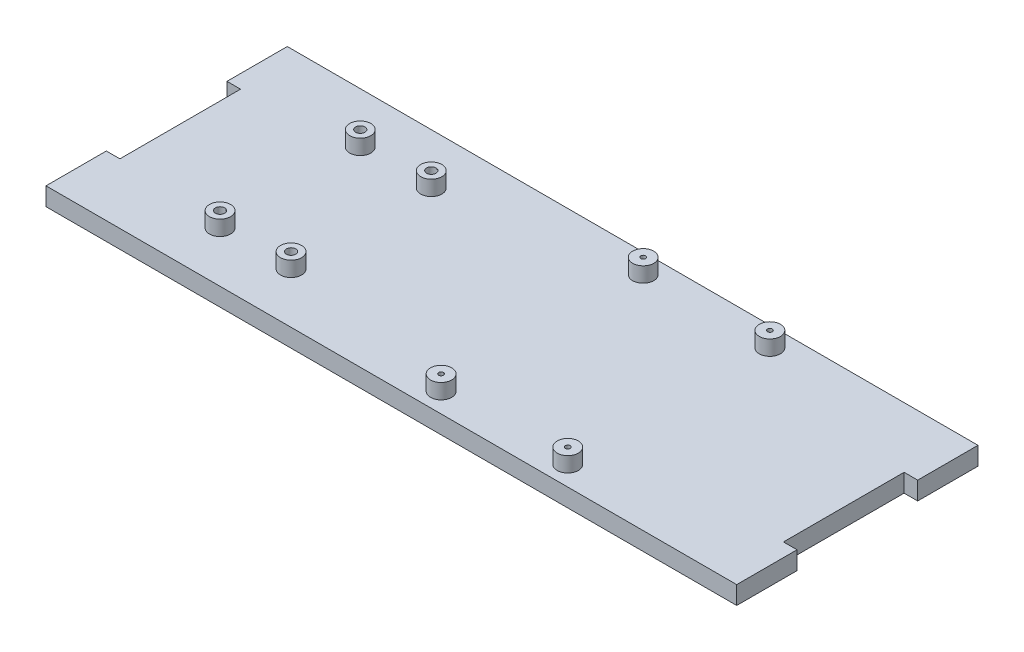
ISO-10303-21;
HEADER;
FILE_DESCRIPTION(('STEP AP214'),'2;1');
FILE_NAME('part.step','',(''),(''),'','','');
FILE_SCHEMA(('AUTOMOTIVE_DESIGN { 1 0 10303 214 1 1 1 1 }'));
ENDSEC;
DATA;
#1=APPLICATION_CONTEXT('core data for automotive mechanical design processes');
#2=APPLICATION_PROTOCOL_DEFINITION('international standard','automotive_design',2000,#1);
#3=PRODUCT_CONTEXT('',#1,'mechanical');
#4=PRODUCT('Part','Part','',(#3));
#5=PRODUCT_RELATED_PRODUCT_CATEGORY('part','',(#4));
#6=PRODUCT_DEFINITION_FORMATION('','',#4);
#7=PRODUCT_DEFINITION_CONTEXT('part definition',#1,'design');
#8=PRODUCT_DEFINITION('design','',#6,#7);
#9=PRODUCT_DEFINITION_SHAPE('','',#8);
#10=(LENGTH_UNIT() NAMED_UNIT(*) SI_UNIT(.MILLI.,.METRE.));
#11=(NAMED_UNIT(*) PLANE_ANGLE_UNIT() SI_UNIT($,.RADIAN.));
#12=(NAMED_UNIT(*) SI_UNIT($,.STERADIAN.) SOLID_ANGLE_UNIT());
#13=UNCERTAINTY_MEASURE_WITH_UNIT(LENGTH_MEASURE(1.E-05),#10,'distance_accuracy_value','');
#14=(GEOMETRIC_REPRESENTATION_CONTEXT(3) GLOBAL_UNCERTAINTY_ASSIGNED_CONTEXT((#13)) GLOBAL_UNIT_ASSIGNED_CONTEXT((#10,
#11,#12)) REPRESENTATION_CONTEXT('',''));
#15=CARTESIAN_POINT('',(0.,0.,0.));
#16=DIRECTION('',(0.,0.,1.));
#17=DIRECTION('',(1.,0.,0.));
#18=AXIS2_PLACEMENT_3D('',#15,#16,#17);
#19=CARTESIAN_POINT('',(0.,6.,0.));
#20=DIRECTION('',(0.,1.,0.));
#21=DIRECTION('',(0.,0.,1.));
#22=AXIS2_PLACEMENT_3D('',#19,#20,#21);
#23=PLANE('',#22);
#24=CARTESIAN_POINT('',(52.,6.,-33.5));
#25=DIRECTION('',(0.,1.,0.));
#26=DIRECTION('',(0.,0.,1.));
#27=AXIS2_PLACEMENT_3D('',#24,#25,#26);
#28=CIRCLE('',#27,3.5);
#29=CARTESIAN_POINT('',(52.,6.,-30.));
#30=VERTEX_POINT('',#29);
#31=EDGE_CURVE('E691',#30,#30,#28,.T.);
#32=ORIENTED_EDGE('',*,*,#31,.F.);
#33=EDGE_LOOP('',(#32));
#34=FACE_BOUND('',#33,.T.);
#35=CARTESIAN_POINT('',(10.,6.,33.5));
#36=DIRECTION('',(0.,1.,0.));
#37=DIRECTION('',(0.,0.,1.));
#38=AXIS2_PLACEMENT_3D('',#35,#36,#37);
#39=CIRCLE('',#38,3.5);
#40=CARTESIAN_POINT('',(10.,6.,37.));
#41=VERTEX_POINT('',#40);
#42=EDGE_CURVE('E709',#41,#41,#39,.T.);
#43=ORIENTED_EDGE('',*,*,#42,.F.);
#44=EDGE_LOOP('',(#43));
#45=FACE_BOUND('',#44,.T.);
#46=CARTESIAN_POINT('',(-73.55,6.,23.25));
#47=DIRECTION('',(0.,1.,0.));
#48=DIRECTION('',(0.,0.,1.));
#49=AXIS2_PLACEMENT_3D('',#46,#47,#48);
#50=CIRCLE('',#49,3.50000000000001);
#51=CARTESIAN_POINT('',(-73.55,6.,26.75));
#52=VERTEX_POINT('',#51);
#53=EDGE_CURVE('E727',#52,#52,#50,.T.);
#54=ORIENTED_EDGE('',*,*,#53,.F.);
#55=EDGE_LOOP('',(#54));
#56=FACE_BOUND('',#55,.T.);
#57=CARTESIAN_POINT('',(-73.55,6.,-23.25));
#58=DIRECTION('',(0.,1.,0.));
#59=DIRECTION('',(0.,0.,1.));
#60=AXIS2_PLACEMENT_3D('',#57,#58,#59);
#61=CIRCLE('',#60,3.50000000000001);
#62=CARTESIAN_POINT('',(-73.55,6.,-19.75));
#63=VERTEX_POINT('',#62);
#64=EDGE_CURVE('E747',#63,#63,#61,.T.);
#65=ORIENTED_EDGE('',*,*,#64,.F.);
#66=EDGE_LOOP('',(#65));
#67=FACE_BOUND('',#66,.T.);
#68=DIRECTION('',(1.,0.,0.));
#69=VECTOR('',#68,1.);
#70=CARTESIAN_POINT('',(-110.,6.,40.));
#71=LINE('',#70,#69);
#72=CARTESIAN_POINT('',(-114.5,6.,40.));
#73=VERTEX_POINT('',#72);
#74=CARTESIAN_POINT('',(114.5,6.,40.));
#75=VERTEX_POINT('',#74);
#76=EDGE_CURVE('E13',#73,#75,#71,.T.);
#77=ORIENTED_EDGE('',*,*,#76,.T.);
#78=DIRECTION('',(0.,0.,-1.));
#79=VECTOR('',#78,1.);
#80=CARTESIAN_POINT('',(114.5,6.,40.));
#81=LINE('',#80,#79);
#82=CARTESIAN_POINT('',(114.5,6.,20.));
#83=VERTEX_POINT('',#82);
#84=EDGE_CURVE('E201',#75,#83,#81,.T.);
#85=ORIENTED_EDGE('',*,*,#84,.T.);
#86=DIRECTION('',(-1.,0.,0.));
#87=VECTOR('',#86,1.);
#88=CARTESIAN_POINT('',(114.5,6.,20.));
#89=LINE('',#88,#87);
#90=CARTESIAN_POINT('',(110.,6.,20.));
#91=VERTEX_POINT('',#90);
#92=EDGE_CURVE('E203',#83,#91,#89,.T.);
#93=ORIENTED_EDGE('',*,*,#92,.T.);
#94=DIRECTION('',(0.,0.,-1.));
#95=VECTOR('',#94,1.);
#96=CARTESIAN_POINT('',(110.,6.,-40.));
#97=LINE('',#96,#95);
#98=CARTESIAN_POINT('',(110.,6.,-20.));
#99=VERTEX_POINT('',#98);
#100=EDGE_CURVE('E231',#91,#99,#97,.T.);
#101=ORIENTED_EDGE('',*,*,#100,.T.);
#102=DIRECTION('',(-1.,0.,0.));
#103=VECTOR('',#102,1.);
#104=CARTESIAN_POINT('',(114.5,6.,-20.));
#105=LINE('',#104,#103);
#106=CARTESIAN_POINT('',(114.5,6.,-20.));
#107=VERTEX_POINT('',#106);
#108=EDGE_CURVE('E227',#107,#99,#105,.T.);
#109=ORIENTED_EDGE('',*,*,#108,.F.);
#110=DIRECTION('',(0.,0.,1.));
#111=VECTOR('',#110,1.);
#112=CARTESIAN_POINT('',(114.5,6.,-40.));
#113=LINE('',#112,#111);
#114=CARTESIAN_POINT('',(114.5,6.,-40.));
#115=VERTEX_POINT('',#114);
#116=EDGE_CURVE('E215',#115,#107,#113,.T.);
#117=ORIENTED_EDGE('',*,*,#116,.F.);
#118=DIRECTION('',(-1.,0.,0.));
#119=VECTOR('',#118,1.);
#120=CARTESIAN_POINT('',(-110.,6.,-40.));
#121=LINE('',#120,#119);
#122=CARTESIAN_POINT('',(-114.5,6.,-40.));
#123=VERTEX_POINT('',#122);
#124=EDGE_CURVE('E233',#115,#123,#121,.T.);
#125=ORIENTED_EDGE('',*,*,#124,.T.);
#126=DIRECTION('',(0.,0.,1.));
#127=VECTOR('',#126,1.);
#128=CARTESIAN_POINT('',(-114.5,6.,-40.));
#129=LINE('',#128,#127);
#130=CARTESIAN_POINT('',(-114.5,6.,-20.));
#131=VERTEX_POINT('',#130);
#132=EDGE_CURVE('E185',#123,#131,#129,.T.);
#133=ORIENTED_EDGE('',*,*,#132,.T.);
#134=DIRECTION('',(1.,0.,0.));
#135=VECTOR('',#134,1.);
#136=CARTESIAN_POINT('',(-114.5,6.,-20.));
#137=LINE('',#136,#135);
#138=CARTESIAN_POINT('',(-110.,6.,-20.));
#139=VERTEX_POINT('',#138);
#140=EDGE_CURVE('E188',#131,#139,#137,.T.);
#141=ORIENTED_EDGE('',*,*,#140,.T.);
#142=DIRECTION('',(0.,0.,1.));
#143=VECTOR('',#142,1.);
#144=CARTESIAN_POINT('',(-110.,6.,-40.));
#145=LINE('',#144,#143);
#146=CARTESIAN_POINT('',(-110.,6.,20.));
#147=VERTEX_POINT('',#146);
#148=EDGE_CURVE('E60',#139,#147,#145,.T.);
#149=ORIENTED_EDGE('',*,*,#148,.T.);
#150=DIRECTION('',(1.,0.,0.));
#151=VECTOR('',#150,1.);
#152=CARTESIAN_POINT('',(-114.5,6.,20.));
#153=LINE('',#152,#151);
#154=CARTESIAN_POINT('',(-114.5,6.,20.));
#155=VERTEX_POINT('',#154);
#156=EDGE_CURVE('E154',#155,#147,#153,.T.);
#157=ORIENTED_EDGE('',*,*,#156,.F.);
#158=DIRECTION('',(0.,0.,-1.));
#159=VECTOR('',#158,1.);
#160=CARTESIAN_POINT('',(-114.5,6.,40.));
#161=LINE('',#160,#159);
#162=EDGE_CURVE('E151',#73,#155,#161,.T.);
#163=ORIENTED_EDGE('',*,*,#162,.F.);
#164=EDGE_LOOP('',(#77,#85,#93,#101,#109,#117,#125,#133,#141,#149,#157,#163));
#165=FACE_BOUND('',#164,.T.);
#166=CARTESIAN_POINT('',(-50.,6.,-23.25));
#167=DIRECTION('',(0.,1.,0.));
#168=DIRECTION('',(0.,0.,1.));
#169=AXIS2_PLACEMENT_3D('',#166,#167,#168);
#170=CIRCLE('',#169,3.5);
#171=CARTESIAN_POINT('',(-50.,6.,-19.75));
#172=VERTEX_POINT('',#171);
#173=EDGE_CURVE('E736',#172,#172,#170,.T.);
#174=ORIENTED_EDGE('',*,*,#173,.F.);
#175=EDGE_LOOP('',(#174));
#176=FACE_BOUND('',#175,.T.);
#177=CARTESIAN_POINT('',(-50.,6.,23.25));
#178=DIRECTION('',(0.,1.,0.));
#179=DIRECTION('',(0.,0.,1.));
#180=AXIS2_PLACEMENT_3D('',#177,#178,#179);
#181=CIRCLE('',#180,3.5);
#182=CARTESIAN_POINT('',(-50.,6.,26.75));
#183=VERTEX_POINT('',#182);
#184=EDGE_CURVE('E718',#183,#183,#181,.T.);
#185=ORIENTED_EDGE('',*,*,#184,.F.);
#186=EDGE_LOOP('',(#185));
#187=FACE_BOUND('',#186,.T.);
#188=CARTESIAN_POINT('',(52.,6.,33.5));
#189=DIRECTION('',(0.,1.,0.));
#190=DIRECTION('',(0.,0.,1.));
#191=AXIS2_PLACEMENT_3D('',#188,#189,#190);
#192=CIRCLE('',#191,3.5);
#193=CARTESIAN_POINT('',(52.,6.,37.));
#194=VERTEX_POINT('',#193);
#195=EDGE_CURVE('E700',#194,#194,#192,.T.);
#196=ORIENTED_EDGE('',*,*,#195,.F.);
#197=EDGE_LOOP('',(#196));
#198=FACE_BOUND('',#197,.T.);
#199=CARTESIAN_POINT('',(9.99999999999999,6.,-33.5));
#200=DIRECTION('',(0.,1.,0.));
#201=DIRECTION('',(0.,0.,1.));
#202=AXIS2_PLACEMENT_3D('',#199,#200,#201);
#203=CIRCLE('',#202,3.5);
#204=CARTESIAN_POINT('',(9.99999999999999,6.,-30.));
#205=VERTEX_POINT('',#204);
#206=EDGE_CURVE('E682',#205,#205,#203,.T.);
#207=ORIENTED_EDGE('',*,*,#206,.F.);
#208=EDGE_LOOP('',(#207));
#209=FACE_BOUND('',#208,.T.);
#210=ADVANCED_FACE('F51',(#34,#45,#56,#67,#165,#176,#187,#198,#209),#23,.T.);
#211=CARTESIAN_POINT('',(-110.,6.,-40.));
#212=DIRECTION('',(1.,0.,0.));
#213=DIRECTION('',(0.,0.,-1.));
#214=AXIS2_PLACEMENT_3D('',#211,#212,#213);
#215=PLANE('',#214);
#216=DIRECTION('',(0.,-1.,0.));
#217=VECTOR('',#216,1.);
#218=CARTESIAN_POINT('',(-110.,6.,20.));
#219=LINE('',#218,#217);
#220=CARTESIAN_POINT('',(-110.,0.,20.));
#221=VERTEX_POINT('',#220);
#222=EDGE_CURVE('E68',#147,#221,#219,.T.);
#223=ORIENTED_EDGE('',*,*,#222,.F.);
#224=ORIENTED_EDGE('',*,*,#148,.F.);
#225=DIRECTION('',(0.,-1.,0.));
#226=VECTOR('',#225,1.);
#227=CARTESIAN_POINT('',(-110.,6.,-20.));
#228=LINE('',#227,#226);
#229=CARTESIAN_POINT('',(-110.,0.,-20.));
#230=VERTEX_POINT('',#229);
#231=EDGE_CURVE('E175',#139,#230,#228,.T.);
#232=ORIENTED_EDGE('',*,*,#231,.T.);
#233=DIRECTION('',(0.,0.,1.));
#234=VECTOR('',#233,1.);
#235=CARTESIAN_POINT('',(-110.,0.,-40.));
#236=LINE('',#235,#234);
#237=EDGE_CURVE('E73',#230,#221,#236,.T.);
#238=ORIENTED_EDGE('',*,*,#237,.T.);
#239=EDGE_LOOP('',(#223,#224,#232,#238));
#240=FACE_BOUND('',#239,.T.);
#241=ADVANCED_FACE('F283',(#240),#215,.F.);
#242=CARTESIAN_POINT('',(110.,6.,-40.));
#243=DIRECTION('',(-1.,0.,0.));
#244=DIRECTION('',(0.,0.,1.));
#245=AXIS2_PLACEMENT_3D('',#242,#243,#244);
#246=PLANE('',#245);
#247=ORIENTED_EDGE('',*,*,#100,.F.);
#248=DIRECTION('',(0.,-1.,0.));
#249=VECTOR('',#248,1.);
#250=CARTESIAN_POINT('',(110.,6.,20.));
#251=LINE('',#250,#249);
#252=CARTESIAN_POINT('',(110.,0.,20.));
#253=VERTEX_POINT('',#252);
#254=EDGE_CURVE('E193',#91,#253,#251,.T.);
#255=ORIENTED_EDGE('',*,*,#254,.T.);
#256=DIRECTION('',(0.,0.,-1.));
#257=VECTOR('',#256,1.);
#258=CARTESIAN_POINT('',(110.,0.,-40.));
#259=LINE('',#258,#257);
#260=CARTESIAN_POINT('',(110.,0.,-20.));
#261=VERTEX_POINT('',#260);
#262=EDGE_CURVE('E230',#253,#261,#259,.T.);
#263=ORIENTED_EDGE('',*,*,#262,.T.);
#264=DIRECTION('',(0.,-1.,0.));
#265=VECTOR('',#264,1.);
#266=CARTESIAN_POINT('',(110.,6.,-20.));
#267=LINE('',#266,#265);
#268=EDGE_CURVE('E211',#99,#261,#267,.T.);
#269=ORIENTED_EDGE('',*,*,#268,.F.);
#270=EDGE_LOOP('',(#247,#255,#263,#269));
#271=FACE_BOUND('',#270,.T.);
#272=ADVANCED_FACE('F53',(#271),#246,.F.);
#273=CARTESIAN_POINT('',(-110.,6.,-40.));
#274=DIRECTION('',(0.,0.,1.));
#275=DIRECTION('',(1.,0.,0.));
#276=AXIS2_PLACEMENT_3D('',#273,#274,#275);
#277=PLANE('',#276);
#278=DIRECTION('',(-1.,0.,0.));
#279=VECTOR('',#278,1.);
#280=CARTESIAN_POINT('',(-110.,0.,-40.));
#281=LINE('',#280,#279);
#282=CARTESIAN_POINT('',(114.5,0.,-40.));
#283=VERTEX_POINT('',#282);
#284=CARTESIAN_POINT('',(-114.5,0.,-40.));
#285=VERTEX_POINT('',#284);
#286=EDGE_CURVE('E237',#283,#285,#281,.T.);
#287=ORIENTED_EDGE('',*,*,#286,.T.);
#288=DIRECTION('',(0.,1.,0.));
#289=VECTOR('',#288,1.);
#290=CARTESIAN_POINT('',(-114.5,6.,-40.));
#291=LINE('',#290,#289);
#292=EDGE_CURVE('E176',#285,#123,#291,.T.);
#293=ORIENTED_EDGE('',*,*,#292,.T.);
#294=ORIENTED_EDGE('',*,*,#124,.F.);
#295=DIRECTION('',(0.,1.,0.));
#296=VECTOR('',#295,1.);
#297=CARTESIAN_POINT('',(114.5,6.,-40.));
#298=LINE('',#297,#296);
#299=EDGE_CURVE('E212',#283,#115,#298,.T.);
#300=ORIENTED_EDGE('',*,*,#299,.F.);
#301=EDGE_LOOP('',(#287,#293,#294,#300));
#302=FACE_BOUND('',#301,.T.);
#303=ADVANCED_FACE('F262',(#302),#277,.F.);
#304=CARTESIAN_POINT('',(-110.,6.,40.));
#305=DIRECTION('',(0.,0.,-1.));
#306=DIRECTION('',(-1.,0.,0.));
#307=AXIS2_PLACEMENT_3D('',#304,#305,#306);
#308=PLANE('',#307);
#309=DIRECTION('',(1.,0.,0.));
#310=VECTOR('',#309,1.);
#311=CARTESIAN_POINT('',(-110.,0.,40.));
#312=LINE('',#311,#310);
#313=CARTESIAN_POINT('',(-114.5,0.,40.));
#314=VERTEX_POINT('',#313);
#315=CARTESIAN_POINT('',(114.5,0.,40.));
#316=VERTEX_POINT('',#315);
#317=EDGE_CURVE('E55',#314,#316,#312,.T.);
#318=ORIENTED_EDGE('',*,*,#317,.T.);
#319=DIRECTION('',(0.,1.,0.));
#320=VECTOR('',#319,1.);
#321=CARTESIAN_POINT('',(114.5,6.,40.));
#322=LINE('',#321,#320);
#323=EDGE_CURVE('E146',#316,#75,#322,.T.);
#324=ORIENTED_EDGE('',*,*,#323,.T.);
#325=ORIENTED_EDGE('',*,*,#76,.F.);
#326=DIRECTION('',(0.,1.,0.));
#327=VECTOR('',#326,1.);
#328=CARTESIAN_POINT('',(-114.5,6.,40.));
#329=LINE('',#328,#327);
#330=EDGE_CURVE('E144',#314,#73,#329,.T.);
#331=ORIENTED_EDGE('',*,*,#330,.F.);
#332=EDGE_LOOP('',(#318,#324,#325,#331));
#333=FACE_BOUND('',#332,.T.);
#334=ADVANCED_FACE('F142',(#333),#308,.F.);
#335=CARTESIAN_POINT('',(0.,0.,0.));
#336=DIRECTION('',(0.,1.,0.));
#337=DIRECTION('',(0.,0.,1.));
#338=AXIS2_PLACEMENT_3D('',#335,#336,#337);
#339=PLANE('',#338);
#340=CARTESIAN_POINT('',(52.,0.,-33.5));
#341=DIRECTION('',(0.,1.,0.));
#342=DIRECTION('',(0.,0.,1.));
#343=AXIS2_PLACEMENT_3D('',#340,#341,#342);
#344=CIRCLE('',#343,0.80000000000001);
#345=CARTESIAN_POINT('',(52.,0.,-32.7));
#346=VERTEX_POINT('',#345);
#347=EDGE_CURVE('E763',#346,#346,#344,.T.);
#348=ORIENTED_EDGE('',*,*,#347,.T.);
#349=EDGE_LOOP('',(#348));
#350=FACE_BOUND('',#349,.T.);
#351=CARTESIAN_POINT('',(52.,0.,33.5));
#352=DIRECTION('',(0.,1.,0.));
#353=DIRECTION('',(0.,0.,1.));
#354=AXIS2_PLACEMENT_3D('',#351,#352,#353);
#355=CIRCLE('',#354,0.799999999999981);
#356=CARTESIAN_POINT('',(52.,0.,34.3));
#357=VERTEX_POINT('',#356);
#358=EDGE_CURVE('E766',#357,#357,#355,.T.);
#359=ORIENTED_EDGE('',*,*,#358,.T.);
#360=EDGE_LOOP('',(#359));
#361=FACE_BOUND('',#360,.T.);
#362=CARTESIAN_POINT('',(10.,0.,33.5));
#363=DIRECTION('',(0.,1.,0.));
#364=DIRECTION('',(0.,0.,1.));
#365=AXIS2_PLACEMENT_3D('',#362,#363,#364);
#366=CIRCLE('',#365,0.799999999999983);
#367=CARTESIAN_POINT('',(10.,0.,34.3));
#368=VERTEX_POINT('',#367);
#369=EDGE_CURVE('E769',#368,#368,#366,.T.);
#370=ORIENTED_EDGE('',*,*,#369,.T.);
#371=EDGE_LOOP('',(#370));
#372=FACE_BOUND('',#371,.T.);
#373=CARTESIAN_POINT('',(-73.55,0.,-23.25));
#374=DIRECTION('',(0.,1.,0.));
#375=DIRECTION('',(0.,0.,1.));
#376=AXIS2_PLACEMENT_3D('',#373,#374,#375);
#377=CIRCLE('',#376,1.54999999999999);
#378=CARTESIAN_POINT('',(-73.55,0.,-21.7));
#379=VERTEX_POINT('',#378);
#380=EDGE_CURVE('E757',#379,#379,#377,.T.);
#381=ORIENTED_EDGE('',*,*,#380,.T.);
#382=EDGE_LOOP('',(#381));
#383=FACE_BOUND('',#382,.T.);
#384=CARTESIAN_POINT('',(-50.,0.,-23.25));
#385=DIRECTION('',(0.,1.,0.));
#386=DIRECTION('',(0.,0.,1.));
#387=AXIS2_PLACEMENT_3D('',#384,#385,#386);
#388=CIRCLE('',#387,1.54999999999999);
#389=CARTESIAN_POINT('',(-50.,0.,-21.7));
#390=VERTEX_POINT('',#389);
#391=EDGE_CURVE('E754',#390,#390,#388,.T.);
#392=ORIENTED_EDGE('',*,*,#391,.T.);
#393=EDGE_LOOP('',(#392));
#394=FACE_BOUND('',#393,.T.);
#395=CARTESIAN_POINT('',(-50.,0.,23.25));
#396=DIRECTION('',(0.,1.,0.));
#397=DIRECTION('',(0.,0.,1.));
#398=AXIS2_PLACEMENT_3D('',#395,#396,#397);
#399=CIRCLE('',#398,1.54999999999999);
#400=CARTESIAN_POINT('',(-50.,0.,24.8));
#401=VERTEX_POINT('',#400);
#402=EDGE_CURVE('E758',#401,#401,#399,.T.);
#403=ORIENTED_EDGE('',*,*,#402,.T.);
#404=EDGE_LOOP('',(#403));
#405=FACE_BOUND('',#404,.T.);
#406=CARTESIAN_POINT('',(-73.55,0.,23.25));
#407=DIRECTION('',(0.,1.,0.));
#408=DIRECTION('',(0.,0.,1.));
#409=AXIS2_PLACEMENT_3D('',#406,#407,#408);
#410=CIRCLE('',#409,1.54999999999999);
#411=CARTESIAN_POINT('',(-73.55,0.,24.8));
#412=VERTEX_POINT('',#411);
#413=EDGE_CURVE('E751',#412,#412,#410,.T.);
#414=ORIENTED_EDGE('',*,*,#413,.T.);
#415=EDGE_LOOP('',(#414));
#416=FACE_BOUND('',#415,.T.);
#417=CARTESIAN_POINT('',(9.99999999999999,0.,-33.5));
#418=DIRECTION('',(0.,1.,0.));
#419=DIRECTION('',(0.,0.,1.));
#420=AXIS2_PLACEMENT_3D('',#417,#418,#419);
#421=CIRCLE('',#420,0.800000000000011);
#422=CARTESIAN_POINT('',(9.99999999999999,0.,-32.7));
#423=VERTEX_POINT('',#422);
#424=EDGE_CURVE('E164',#423,#423,#421,.T.);
#425=ORIENTED_EDGE('',*,*,#424,.T.);
#426=EDGE_LOOP('',(#425));
#427=FACE_BOUND('',#426,.T.);
#428=ORIENTED_EDGE('',*,*,#262,.F.);
#429=DIRECTION('',(-1.,0.,0.));
#430=VECTOR('',#429,1.);
#431=CARTESIAN_POINT('',(114.5,0.,20.));
#432=LINE('',#431,#430);
#433=CARTESIAN_POINT('',(114.5,0.,20.));
#434=VERTEX_POINT('',#433);
#435=EDGE_CURVE('E208',#434,#253,#432,.T.);
#436=ORIENTED_EDGE('',*,*,#435,.F.);
#437=DIRECTION('',(0.,0.,1.));
#438=VECTOR('',#437,1.);
#439=CARTESIAN_POINT('',(114.5,0.,40.));
#440=LINE('',#439,#438);
#441=EDGE_CURVE('E195',#434,#316,#440,.T.);
#442=ORIENTED_EDGE('',*,*,#441,.T.);
#443=ORIENTED_EDGE('',*,*,#317,.F.);
#444=DIRECTION('',(0.,0.,1.));
#445=VECTOR('',#444,1.);
#446=CARTESIAN_POINT('',(-114.5,0.,40.));
#447=LINE('',#446,#445);
#448=CARTESIAN_POINT('',(-114.5,0.,20.));
#449=VERTEX_POINT('',#448);
#450=EDGE_CURVE('E162',#449,#314,#447,.T.);
#451=ORIENTED_EDGE('',*,*,#450,.F.);
#452=DIRECTION('',(1.,0.,0.));
#453=VECTOR('',#452,1.);
#454=CARTESIAN_POINT('',(-114.5,0.,20.));
#455=LINE('',#454,#453);
#456=EDGE_CURVE('E170',#449,#221,#455,.T.);
#457=ORIENTED_EDGE('',*,*,#456,.T.);
#458=ORIENTED_EDGE('',*,*,#237,.F.);
#459=DIRECTION('',(1.,0.,0.));
#460=VECTOR('',#459,1.);
#461=CARTESIAN_POINT('',(-114.5,0.,-20.));
#462=LINE('',#461,#460);
#463=CARTESIAN_POINT('',(-114.5,0.,-20.));
#464=VERTEX_POINT('',#463);
#465=EDGE_CURVE('E191',#464,#230,#462,.T.);
#466=ORIENTED_EDGE('',*,*,#465,.F.);
#467=DIRECTION('',(0.,0.,-1.));
#468=VECTOR('',#467,1.);
#469=CARTESIAN_POINT('',(-114.5,0.,-40.));
#470=LINE('',#469,#468);
#471=EDGE_CURVE('E179',#464,#285,#470,.T.);
#472=ORIENTED_EDGE('',*,*,#471,.T.);
#473=ORIENTED_EDGE('',*,*,#286,.F.);
#474=DIRECTION('',(0.,0.,-1.));
#475=VECTOR('',#474,1.);
#476=CARTESIAN_POINT('',(114.5,0.,-40.));
#477=LINE('',#476,#475);
#478=CARTESIAN_POINT('',(114.5,0.,-20.));
#479=VERTEX_POINT('',#478);
#480=EDGE_CURVE('E219',#479,#283,#477,.T.);
#481=ORIENTED_EDGE('',*,*,#480,.F.);
#482=DIRECTION('',(-1.,0.,0.));
#483=VECTOR('',#482,1.);
#484=CARTESIAN_POINT('',(114.5,0.,-20.));
#485=LINE('',#484,#483);
#486=EDGE_CURVE('E222',#479,#261,#485,.T.);
#487=ORIENTED_EDGE('',*,*,#486,.T.);
#488=EDGE_LOOP('',(#428,#436,#442,#443,#451,#457,#458,#466,#472,#473,#481,#487));
#489=FACE_BOUND('',#488,.T.);
#490=ADVANCED_FACE('F243',(#350,#361,#372,#383,#394,#405,#416,#427,#489),#339,.F.);
#491=CARTESIAN_POINT('',(114.5,6.,-20.));
#492=DIRECTION('',(0.,0.,-1.));
#493=DIRECTION('',(0.,1.,0.));
#494=AXIS2_PLACEMENT_3D('',#491,#492,#493);
#495=PLANE('',#494);
#496=ORIENTED_EDGE('',*,*,#268,.T.);
#497=ORIENTED_EDGE('',*,*,#486,.F.);
#498=DIRECTION('',(0.,-1.,0.));
#499=VECTOR('',#498,1.);
#500=CARTESIAN_POINT('',(114.5,6.,-20.));
#501=LINE('',#500,#499);
#502=EDGE_CURVE('E217',#107,#479,#501,.T.);
#503=ORIENTED_EDGE('',*,*,#502,.F.);
#504=ORIENTED_EDGE('',*,*,#108,.T.);
#505=EDGE_LOOP('',(#496,#497,#503,#504));
#506=FACE_BOUND('',#505,.T.);
#507=ADVANCED_FACE('F254',(#506),#495,.F.);
#508=CARTESIAN_POINT('',(114.5,2.54426109809932E-13,0.));
#509=DIRECTION('',(-1.,0.,0.));
#510=DIRECTION('',(0.,-1.,0.));
#511=AXIS2_PLACEMENT_3D('',#508,#509,#510);
#512=PLANE('',#511);
#513=ORIENTED_EDGE('',*,*,#299,.T.);
#514=ORIENTED_EDGE('',*,*,#116,.T.);
#515=ORIENTED_EDGE('',*,*,#502,.T.);
#516=ORIENTED_EDGE('',*,*,#480,.T.);
#517=EDGE_LOOP('',(#513,#514,#515,#516));
#518=FACE_BOUND('',#517,.T.);
#519=ADVANCED_FACE('F257',(#518),#512,.F.);
#520=CARTESIAN_POINT('',(114.5,6.,20.));
#521=DIRECTION('',(0.,0.,-1.));
#522=DIRECTION('',(0.,1.,0.));
#523=AXIS2_PLACEMENT_3D('',#520,#521,#522);
#524=PLANE('',#523);
#525=ORIENTED_EDGE('',*,*,#254,.F.);
#526=ORIENTED_EDGE('',*,*,#92,.F.);
#527=DIRECTION('',(0.,-1.,0.));
#528=VECTOR('',#527,1.);
#529=CARTESIAN_POINT('',(114.5,6.,20.));
#530=LINE('',#529,#528);
#531=EDGE_CURVE('E198',#83,#434,#530,.T.);
#532=ORIENTED_EDGE('',*,*,#531,.T.);
#533=ORIENTED_EDGE('',*,*,#435,.T.);
#534=EDGE_LOOP('',(#525,#526,#532,#533));
#535=FACE_BOUND('',#534,.T.);
#536=ADVANCED_FACE('F246',(#535),#524,.T.);
#537=CARTESIAN_POINT('',(114.5,2.54426109809932E-13,0.));
#538=DIRECTION('',(-1.,0.,0.));
#539=DIRECTION('',(0.,-1.,0.));
#540=AXIS2_PLACEMENT_3D('',#537,#538,#539);
#541=PLANE('',#540);
#542=ORIENTED_EDGE('',*,*,#323,.F.);
#543=ORIENTED_EDGE('',*,*,#441,.F.);
#544=ORIENTED_EDGE('',*,*,#531,.F.);
#545=ORIENTED_EDGE('',*,*,#84,.F.);
#546=EDGE_LOOP('',(#542,#543,#544,#545));
#547=FACE_BOUND('',#546,.T.);
#548=ADVANCED_FACE('F241',(#547),#541,.F.);
#549=CARTESIAN_POINT('',(-114.5,6.,-20.));
#550=DIRECTION('',(0.,0.,1.));
#551=DIRECTION('',(0.,-1.,0.));
#552=AXIS2_PLACEMENT_3D('',#549,#550,#551);
#553=PLANE('',#552);
#554=ORIENTED_EDGE('',*,*,#231,.F.);
#555=ORIENTED_EDGE('',*,*,#140,.F.);
#556=DIRECTION('',(0.,-1.,0.));
#557=VECTOR('',#556,1.);
#558=CARTESIAN_POINT('',(-114.5,6.,-20.));
#559=LINE('',#558,#557);
#560=EDGE_CURVE('E182',#131,#464,#559,.T.);
#561=ORIENTED_EDGE('',*,*,#560,.T.);
#562=ORIENTED_EDGE('',*,*,#465,.T.);
#563=EDGE_LOOP('',(#554,#555,#561,#562));
#564=FACE_BOUND('',#563,.T.);
#565=ADVANCED_FACE('F269',(#564),#553,.T.);
#566=CARTESIAN_POINT('',(-114.5,2.54426109809932E-13,0.));
#567=DIRECTION('',(1.,0.,0.));
#568=DIRECTION('',(0.,-1.,0.));
#569=AXIS2_PLACEMENT_3D('',#566,#567,#568);
#570=PLANE('',#569);
#571=ORIENTED_EDGE('',*,*,#292,.F.);
#572=ORIENTED_EDGE('',*,*,#471,.F.);
#573=ORIENTED_EDGE('',*,*,#560,.F.);
#574=ORIENTED_EDGE('',*,*,#132,.F.);
#575=EDGE_LOOP('',(#571,#572,#573,#574));
#576=FACE_BOUND('',#575,.T.);
#577=ADVANCED_FACE('F266',(#576),#570,.F.);
#578=CARTESIAN_POINT('',(-114.5,6.,20.));
#579=DIRECTION('',(0.,0.,1.));
#580=DIRECTION('',(0.,-1.,0.));
#581=AXIS2_PLACEMENT_3D('',#578,#579,#580);
#582=PLANE('',#581);
#583=ORIENTED_EDGE('',*,*,#222,.T.);
#584=ORIENTED_EDGE('',*,*,#456,.F.);
#585=DIRECTION('',(0.,-1.,0.));
#586=VECTOR('',#585,1.);
#587=CARTESIAN_POINT('',(-114.5,6.,20.));
#588=LINE('',#587,#586);
#589=EDGE_CURVE('E157',#155,#449,#588,.T.);
#590=ORIENTED_EDGE('',*,*,#589,.F.);
#591=ORIENTED_EDGE('',*,*,#156,.T.);
#592=EDGE_LOOP('',(#583,#584,#590,#591));
#593=FACE_BOUND('',#592,.T.);
#594=ADVANCED_FACE('F271',(#593),#582,.F.);
#595=CARTESIAN_POINT('',(-114.5,2.54426109809932E-13,0.));
#596=DIRECTION('',(1.,0.,0.));
#597=DIRECTION('',(0.,-1.,0.));
#598=AXIS2_PLACEMENT_3D('',#595,#596,#597);
#599=PLANE('',#598);
#600=ORIENTED_EDGE('',*,*,#330,.T.);
#601=ORIENTED_EDGE('',*,*,#162,.T.);
#602=ORIENTED_EDGE('',*,*,#589,.T.);
#603=ORIENTED_EDGE('',*,*,#450,.T.);
#604=EDGE_LOOP('',(#600,#601,#602,#603));
#605=FACE_BOUND('',#604,.T.);
#606=ADVANCED_FACE('F160',(#605),#599,.F.);
#607=CARTESIAN_POINT('',(9.99999999999999,0.,-33.5));
#608=DIRECTION('',(0.,1.,0.));
#609=DIRECTION('',(0.,0.,1.));
#610=AXIS2_PLACEMENT_3D('',#607,#608,#609);
#611=CYLINDRICAL_SURFACE('',#610,0.800000000000011);
#612=ORIENTED_EDGE('',*,*,#424,.F.);
#613=EDGE_LOOP('',(#612));
#614=FACE_BOUND('',#613,.T.);
#615=CARTESIAN_POINT('',(9.99999999999999,11.,-33.5));
#616=DIRECTION('',(0.,1.,0.));
#617=DIRECTION('',(0.,0.,1.));
#618=AXIS2_PLACEMENT_3D('',#615,#616,#617);
#619=CIRCLE('',#618,0.80000000000001);
#620=CARTESIAN_POINT('',(9.99999999999999,11.,-32.7));
#621=VERTEX_POINT('',#620);
#622=EDGE_CURVE('E684',#621,#621,#619,.T.);
#623=ORIENTED_EDGE('',*,*,#622,.T.);
#624=EDGE_LOOP('',(#623));
#625=FACE_BOUND('',#624,.T.);
#626=ADVANCED_FACE('F279',(#614,#625),#611,.F.);
#627=CARTESIAN_POINT('',(-73.55,0.,23.25));
#628=DIRECTION('',(0.,1.,0.));
#629=DIRECTION('',(0.,0.,1.));
#630=AXIS2_PLACEMENT_3D('',#627,#628,#629);
#631=CYLINDRICAL_SURFACE('',#630,1.54999999999999);
#632=ORIENTED_EDGE('',*,*,#413,.F.);
#633=EDGE_LOOP('',(#632));
#634=FACE_BOUND('',#633,.T.);
#635=CARTESIAN_POINT('',(-73.55,11.,23.25));
#636=DIRECTION('',(0.,1.,0.));
#637=DIRECTION('',(0.,0.,1.));
#638=AXIS2_PLACEMENT_3D('',#635,#636,#637);
#639=CIRCLE('',#638,1.54999999999999);
#640=CARTESIAN_POINT('',(-73.55,11.,24.8));
#641=VERTEX_POINT('',#640);
#642=EDGE_CURVE('E730',#641,#641,#639,.T.);
#643=ORIENTED_EDGE('',*,*,#642,.T.);
#644=EDGE_LOOP('',(#643));
#645=FACE_BOUND('',#644,.T.);
#646=ADVANCED_FACE('F404',(#634,#645),#631,.F.);
#647=CARTESIAN_POINT('',(-50.,0.,23.25));
#648=DIRECTION('',(0.,1.,0.));
#649=DIRECTION('',(0.,0.,1.));
#650=AXIS2_PLACEMENT_3D('',#647,#648,#649);
#651=CYLINDRICAL_SURFACE('',#650,1.54999999999999);
#652=ORIENTED_EDGE('',*,*,#402,.F.);
#653=EDGE_LOOP('',(#652));
#654=FACE_BOUND('',#653,.T.);
#655=CARTESIAN_POINT('',(-50.,11.,23.25));
#656=DIRECTION('',(0.,1.,0.));
#657=DIRECTION('',(0.,0.,1.));
#658=AXIS2_PLACEMENT_3D('',#655,#656,#657);
#659=CIRCLE('',#658,1.54999999999999);
#660=CARTESIAN_POINT('',(-50.,11.,24.8));
#661=VERTEX_POINT('',#660);
#662=EDGE_CURVE('E721',#661,#661,#659,.T.);
#663=ORIENTED_EDGE('',*,*,#662,.T.);
#664=EDGE_LOOP('',(#663));
#665=FACE_BOUND('',#664,.T.);
#666=ADVANCED_FACE('F416',(#654,#665),#651,.F.);
#667=CARTESIAN_POINT('',(-50.,0.,-23.25));
#668=DIRECTION('',(0.,1.,0.));
#669=DIRECTION('',(0.,0.,1.));
#670=AXIS2_PLACEMENT_3D('',#667,#668,#669);
#671=CYLINDRICAL_SURFACE('',#670,1.54999999999999);
#672=ORIENTED_EDGE('',*,*,#391,.F.);
#673=EDGE_LOOP('',(#672));
#674=FACE_BOUND('',#673,.T.);
#675=CARTESIAN_POINT('',(-50.,11.,-23.25));
#676=DIRECTION('',(0.,1.,0.));
#677=DIRECTION('',(0.,0.,1.));
#678=AXIS2_PLACEMENT_3D('',#675,#676,#677);
#679=CIRCLE('',#678,1.54999999999999);
#680=CARTESIAN_POINT('',(-50.,11.,-21.7));
#681=VERTEX_POINT('',#680);
#682=EDGE_CURVE('E739',#681,#681,#679,.T.);
#683=ORIENTED_EDGE('',*,*,#682,.T.);
#684=EDGE_LOOP('',(#683));
#685=FACE_BOUND('',#684,.T.);
#686=ADVANCED_FACE('F428',(#674,#685),#671,.F.);
#687=CARTESIAN_POINT('',(-73.55,0.,-23.25));
#688=DIRECTION('',(0.,1.,0.));
#689=DIRECTION('',(0.,0.,1.));
#690=AXIS2_PLACEMENT_3D('',#687,#688,#689);
#691=CYLINDRICAL_SURFACE('',#690,1.54999999999999);
#692=ORIENTED_EDGE('',*,*,#380,.F.);
#693=EDGE_LOOP('',(#692));
#694=FACE_BOUND('',#693,.T.);
#695=CARTESIAN_POINT('',(-73.55,11.,-23.25));
#696=DIRECTION('',(0.,1.,0.));
#697=DIRECTION('',(0.,0.,1.));
#698=AXIS2_PLACEMENT_3D('',#695,#696,#697);
#699=CIRCLE('',#698,1.54999999999999);
#700=CARTESIAN_POINT('',(-73.55,11.,-21.7));
#701=VERTEX_POINT('',#700);
#702=EDGE_CURVE('E744',#701,#701,#699,.T.);
#703=ORIENTED_EDGE('',*,*,#702,.T.);
#704=EDGE_LOOP('',(#703));
#705=FACE_BOUND('',#704,.T.);
#706=ADVANCED_FACE('F440',(#694,#705),#691,.F.);
#707=CARTESIAN_POINT('',(10.,0.,33.5));
#708=DIRECTION('',(0.,1.,0.));
#709=DIRECTION('',(0.,0.,1.));
#710=AXIS2_PLACEMENT_3D('',#707,#708,#709);
#711=CYLINDRICAL_SURFACE('',#710,0.799999999999983);
#712=ORIENTED_EDGE('',*,*,#369,.F.);
#713=EDGE_LOOP('',(#712));
#714=FACE_BOUND('',#713,.T.);
#715=CARTESIAN_POINT('',(10.,11.,33.5));
#716=DIRECTION('',(0.,1.,0.));
#717=DIRECTION('',(0.,0.,1.));
#718=AXIS2_PLACEMENT_3D('',#715,#716,#717);
#719=CIRCLE('',#718,0.799999999999981);
#720=CARTESIAN_POINT('',(10.,11.,34.3));
#721=VERTEX_POINT('',#720);
#722=EDGE_CURVE('E712',#721,#721,#719,.T.);
#723=ORIENTED_EDGE('',*,*,#722,.T.);
#724=EDGE_LOOP('',(#723));
#725=FACE_BOUND('',#724,.T.);
#726=ADVANCED_FACE('F452',(#714,#725),#711,.F.);
#727=CARTESIAN_POINT('',(52.,0.,33.5));
#728=DIRECTION('',(0.,1.,0.));
#729=DIRECTION('',(0.,0.,1.));
#730=AXIS2_PLACEMENT_3D('',#727,#728,#729);
#731=CYLINDRICAL_SURFACE('',#730,0.799999999999981);
#732=ORIENTED_EDGE('',*,*,#358,.F.);
#733=EDGE_LOOP('',(#732));
#734=FACE_BOUND('',#733,.T.);
#735=CARTESIAN_POINT('',(52.,11.,33.5));
#736=DIRECTION('',(0.,1.,0.));
#737=DIRECTION('',(0.,0.,1.));
#738=AXIS2_PLACEMENT_3D('',#735,#736,#737);
#739=CIRCLE('',#738,0.799999999999981);
#740=CARTESIAN_POINT('',(52.,11.,34.3));
#741=VERTEX_POINT('',#740);
#742=EDGE_CURVE('E703',#741,#741,#739,.T.);
#743=ORIENTED_EDGE('',*,*,#742,.T.);
#744=EDGE_LOOP('',(#743));
#745=FACE_BOUND('',#744,.T.);
#746=ADVANCED_FACE('F464',(#734,#745),#731,.F.);
#747=CARTESIAN_POINT('',(52.,0.,-33.5));
#748=DIRECTION('',(0.,1.,0.));
#749=DIRECTION('',(0.,0.,1.));
#750=AXIS2_PLACEMENT_3D('',#747,#748,#749);
#751=CYLINDRICAL_SURFACE('',#750,0.80000000000001);
#752=ORIENTED_EDGE('',*,*,#347,.F.);
#753=EDGE_LOOP('',(#752));
#754=FACE_BOUND('',#753,.T.);
#755=CARTESIAN_POINT('',(52.,11.,-33.5));
#756=DIRECTION('',(0.,1.,0.));
#757=DIRECTION('',(0.,0.,1.));
#758=AXIS2_PLACEMENT_3D('',#755,#756,#757);
#759=CIRCLE('',#758,0.80000000000001);
#760=CARTESIAN_POINT('',(52.,11.,-32.7));
#761=VERTEX_POINT('',#760);
#762=EDGE_CURVE('E694',#761,#761,#759,.T.);
#763=ORIENTED_EDGE('',*,*,#762,.T.);
#764=EDGE_LOOP('',(#763));
#765=FACE_BOUND('',#764,.T.);
#766=ADVANCED_FACE('F476',(#754,#765),#751,.F.);
#767=CARTESIAN_POINT('',(-73.55,11.,-23.25));
#768=DIRECTION('',(0.,1.,0.));
#769=DIRECTION('',(0.,0.,1.));
#770=AXIS2_PLACEMENT_3D('',#767,#768,#769);
#771=PLANE('',#770);
#772=CARTESIAN_POINT('',(-73.55,11.,-23.25));
#773=DIRECTION('',(0.,1.,0.));
#774=DIRECTION('',(0.,0.,1.));
#775=AXIS2_PLACEMENT_3D('',#772,#773,#774);
#776=CIRCLE('',#775,3.50000000000001);
#777=CARTESIAN_POINT('',(-73.55,11.,-19.75));
#778=VERTEX_POINT('',#777);
#779=EDGE_CURVE('E748',#778,#778,#776,.T.);
#780=ORIENTED_EDGE('',*,*,#779,.T.);
#781=EDGE_LOOP('',(#780));
#782=FACE_BOUND('',#781,.T.);
#783=ORIENTED_EDGE('',*,*,#702,.F.);
#784=EDGE_LOOP('',(#783));
#785=FACE_BOUND('',#784,.T.);
#786=ADVANCED_FACE('F488',(#782,#785),#771,.T.);
#787=CARTESIAN_POINT('',(-73.55,11.,-23.25));
#788=DIRECTION('',(0.,-1.,0.));
#789=DIRECTION('',(0.,0.,-1.));
#790=AXIS2_PLACEMENT_3D('',#787,#788,#789);
#791=CYLINDRICAL_SURFACE('',#790,3.50000000000001);
#792=ORIENTED_EDGE('',*,*,#779,.F.);
#793=EDGE_LOOP('',(#792));
#794=FACE_BOUND('',#793,.T.);
#795=ORIENTED_EDGE('',*,*,#64,.T.);
#796=EDGE_LOOP('',(#795));
#797=FACE_BOUND('',#796,.T.);
#798=ADVANCED_FACE('F514',(#794,#797),#791,.T.);
#799=CARTESIAN_POINT('',(-50.,11.,-23.25));
#800=DIRECTION('',(0.,1.,0.));
#801=DIRECTION('',(0.,0.,1.));
#802=AXIS2_PLACEMENT_3D('',#799,#800,#801);
#803=PLANE('',#802);
#804=CARTESIAN_POINT('',(-50.,11.,-23.25));
#805=DIRECTION('',(0.,1.,0.));
#806=DIRECTION('',(0.,0.,1.));
#807=AXIS2_PLACEMENT_3D('',#804,#805,#806);
#808=CIRCLE('',#807,3.5);
#809=CARTESIAN_POINT('',(-50.,11.,-19.75));
#810=VERTEX_POINT('',#809);
#811=EDGE_CURVE('E735',#810,#810,#808,.T.);
#812=ORIENTED_EDGE('',*,*,#811,.T.);
#813=EDGE_LOOP('',(#812));
#814=FACE_BOUND('',#813,.T.);
#815=ORIENTED_EDGE('',*,*,#682,.F.);
#816=EDGE_LOOP('',(#815));
#817=FACE_BOUND('',#816,.T.);
#818=ADVANCED_FACE('F523',(#814,#817),#803,.T.);
#819=CARTESIAN_POINT('',(-50.,11.,-23.25));
#820=DIRECTION('',(0.,-1.,0.));
#821=DIRECTION('',(0.,0.,-1.));
#822=AXIS2_PLACEMENT_3D('',#819,#820,#821);
#823=CYLINDRICAL_SURFACE('',#822,3.5);
#824=ORIENTED_EDGE('',*,*,#811,.F.);
#825=EDGE_LOOP('',(#824));
#826=FACE_BOUND('',#825,.T.);
#827=ORIENTED_EDGE('',*,*,#173,.T.);
#828=EDGE_LOOP('',(#827));
#829=FACE_BOUND('',#828,.T.);
#830=ADVANCED_FACE('F532',(#826,#829),#823,.T.);
#831=CARTESIAN_POINT('',(-73.55,11.,23.25));
#832=DIRECTION('',(0.,1.,0.));
#833=DIRECTION('',(0.,0.,1.));
#834=AXIS2_PLACEMENT_3D('',#831,#832,#833);
#835=PLANE('',#834);
#836=CARTESIAN_POINT('',(-73.55,11.,23.25));
#837=DIRECTION('',(0.,1.,0.));
#838=DIRECTION('',(0.,0.,1.));
#839=AXIS2_PLACEMENT_3D('',#836,#837,#838);
#840=CIRCLE('',#839,3.50000000000001);
#841=CARTESIAN_POINT('',(-73.55,11.,26.75));
#842=VERTEX_POINT('',#841);
#843=EDGE_CURVE('E726',#842,#842,#840,.T.);
#844=ORIENTED_EDGE('',*,*,#843,.T.);
#845=EDGE_LOOP('',(#844));
#846=FACE_BOUND('',#845,.T.);
#847=ORIENTED_EDGE('',*,*,#642,.F.);
#848=EDGE_LOOP('',(#847));
#849=FACE_BOUND('',#848,.T.);
#850=ADVANCED_FACE('F541',(#846,#849),#835,.T.);
#851=CARTESIAN_POINT('',(-73.55,11.,23.25));
#852=DIRECTION('',(0.,-1.,0.));
#853=DIRECTION('',(0.,0.,-1.));
#854=AXIS2_PLACEMENT_3D('',#851,#852,#853);
#855=CYLINDRICAL_SURFACE('',#854,3.50000000000001);
#856=ORIENTED_EDGE('',*,*,#843,.F.);
#857=EDGE_LOOP('',(#856));
#858=FACE_BOUND('',#857,.T.);
#859=ORIENTED_EDGE('',*,*,#53,.T.);
#860=EDGE_LOOP('',(#859));
#861=FACE_BOUND('',#860,.T.);
#862=ADVANCED_FACE('F550',(#858,#861),#855,.T.);
#863=CARTESIAN_POINT('',(-50.,11.,23.25));
#864=DIRECTION('',(0.,1.,0.));
#865=DIRECTION('',(0.,0.,1.));
#866=AXIS2_PLACEMENT_3D('',#863,#864,#865);
#867=PLANE('',#866);
#868=CARTESIAN_POINT('',(-50.,11.,23.25));
#869=DIRECTION('',(0.,1.,0.));
#870=DIRECTION('',(0.,0.,1.));
#871=AXIS2_PLACEMENT_3D('',#868,#869,#870);
#872=CIRCLE('',#871,3.5);
#873=CARTESIAN_POINT('',(-50.,11.,26.75));
#874=VERTEX_POINT('',#873);
#875=EDGE_CURVE('E717',#874,#874,#872,.T.);
#876=ORIENTED_EDGE('',*,*,#875,.T.);
#877=EDGE_LOOP('',(#876));
#878=FACE_BOUND('',#877,.T.);
#879=ORIENTED_EDGE('',*,*,#662,.F.);
#880=EDGE_LOOP('',(#879));
#881=FACE_BOUND('',#880,.T.);
#882=ADVANCED_FACE('F559',(#878,#881),#867,.T.);
#883=CARTESIAN_POINT('',(-50.,11.,23.25));
#884=DIRECTION('',(0.,-1.,0.));
#885=DIRECTION('',(0.,0.,-1.));
#886=AXIS2_PLACEMENT_3D('',#883,#884,#885);
#887=CYLINDRICAL_SURFACE('',#886,3.5);
#888=ORIENTED_EDGE('',*,*,#875,.F.);
#889=EDGE_LOOP('',(#888));
#890=FACE_BOUND('',#889,.T.);
#891=ORIENTED_EDGE('',*,*,#184,.T.);
#892=EDGE_LOOP('',(#891));
#893=FACE_BOUND('',#892,.T.);
#894=ADVANCED_FACE('F568',(#890,#893),#887,.T.);
#895=CARTESIAN_POINT('',(10.,11.,33.5));
#896=DIRECTION('',(0.,1.,0.));
#897=DIRECTION('',(0.,0.,1.));
#898=AXIS2_PLACEMENT_3D('',#895,#896,#897);
#899=PLANE('',#898);
#900=CARTESIAN_POINT('',(10.,11.,33.5));
#901=DIRECTION('',(0.,1.,0.));
#902=DIRECTION('',(0.,0.,1.));
#903=AXIS2_PLACEMENT_3D('',#900,#901,#902);
#904=CIRCLE('',#903,3.5);
#905=CARTESIAN_POINT('',(10.,11.,37.));
#906=VERTEX_POINT('',#905);
#907=EDGE_CURVE('E708',#906,#906,#904,.T.);
#908=ORIENTED_EDGE('',*,*,#907,.T.);
#909=EDGE_LOOP('',(#908));
#910=FACE_BOUND('',#909,.T.);
#911=ORIENTED_EDGE('',*,*,#722,.F.);
#912=EDGE_LOOP('',(#911));
#913=FACE_BOUND('',#912,.T.);
#914=ADVANCED_FACE('F577',(#910,#913),#899,.T.);
#915=CARTESIAN_POINT('',(10.,11.,33.5));
#916=DIRECTION('',(0.,-1.,0.));
#917=DIRECTION('',(0.,0.,-1.));
#918=AXIS2_PLACEMENT_3D('',#915,#916,#917);
#919=CYLINDRICAL_SURFACE('',#918,3.5);
#920=ORIENTED_EDGE('',*,*,#907,.F.);
#921=EDGE_LOOP('',(#920));
#922=FACE_BOUND('',#921,.T.);
#923=ORIENTED_EDGE('',*,*,#42,.T.);
#924=EDGE_LOOP('',(#923));
#925=FACE_BOUND('',#924,.T.);
#926=ADVANCED_FACE('F586',(#922,#925),#919,.T.);
#927=CARTESIAN_POINT('',(52.,11.,33.5));
#928=DIRECTION('',(0.,1.,0.));
#929=DIRECTION('',(0.,0.,1.));
#930=AXIS2_PLACEMENT_3D('',#927,#928,#929);
#931=PLANE('',#930);
#932=CARTESIAN_POINT('',(52.,11.,33.5));
#933=DIRECTION('',(0.,1.,0.));
#934=DIRECTION('',(0.,0.,1.));
#935=AXIS2_PLACEMENT_3D('',#932,#933,#934);
#936=CIRCLE('',#935,3.5);
#937=CARTESIAN_POINT('',(52.,11.,37.));
#938=VERTEX_POINT('',#937);
#939=EDGE_CURVE('E699',#938,#938,#936,.T.);
#940=ORIENTED_EDGE('',*,*,#939,.T.);
#941=EDGE_LOOP('',(#940));
#942=FACE_BOUND('',#941,.T.);
#943=ORIENTED_EDGE('',*,*,#742,.F.);
#944=EDGE_LOOP('',(#943));
#945=FACE_BOUND('',#944,.T.);
#946=ADVANCED_FACE('F595',(#942,#945),#931,.T.);
#947=CARTESIAN_POINT('',(52.,11.,33.5));
#948=DIRECTION('',(0.,-1.,0.));
#949=DIRECTION('',(0.,0.,-1.));
#950=AXIS2_PLACEMENT_3D('',#947,#948,#949);
#951=CYLINDRICAL_SURFACE('',#950,3.5);
#952=ORIENTED_EDGE('',*,*,#939,.F.);
#953=EDGE_LOOP('',(#952));
#954=FACE_BOUND('',#953,.T.);
#955=ORIENTED_EDGE('',*,*,#195,.T.);
#956=EDGE_LOOP('',(#955));
#957=FACE_BOUND('',#956,.T.);
#958=ADVANCED_FACE('F604',(#954,#957),#951,.T.);
#959=CARTESIAN_POINT('',(52.,11.,-33.5));
#960=DIRECTION('',(0.,1.,0.));
#961=DIRECTION('',(0.,0.,1.));
#962=AXIS2_PLACEMENT_3D('',#959,#960,#961);
#963=PLANE('',#962);
#964=CARTESIAN_POINT('',(52.,11.,-33.5));
#965=DIRECTION('',(0.,1.,0.));
#966=DIRECTION('',(0.,0.,1.));
#967=AXIS2_PLACEMENT_3D('',#964,#965,#966);
#968=CIRCLE('',#967,3.5);
#969=CARTESIAN_POINT('',(52.,11.,-30.));
#970=VERTEX_POINT('',#969);
#971=EDGE_CURVE('E687',#970,#970,#968,.T.);
#972=ORIENTED_EDGE('',*,*,#971,.T.);
#973=EDGE_LOOP('',(#972));
#974=FACE_BOUND('',#973,.T.);
#975=ORIENTED_EDGE('',*,*,#762,.F.);
#976=EDGE_LOOP('',(#975));
#977=FACE_BOUND('',#976,.T.);
#978=ADVANCED_FACE('F613',(#974,#977),#963,.T.);
#979=CARTESIAN_POINT('',(52.,11.,-33.5));
#980=DIRECTION('',(0.,-1.,0.));
#981=DIRECTION('',(0.,0.,-1.));
#982=AXIS2_PLACEMENT_3D('',#979,#980,#981);
#983=CYLINDRICAL_SURFACE('',#982,3.5);
#984=ORIENTED_EDGE('',*,*,#971,.F.);
#985=EDGE_LOOP('',(#984));
#986=FACE_BOUND('',#985,.T.);
#987=ORIENTED_EDGE('',*,*,#31,.T.);
#988=EDGE_LOOP('',(#987));
#989=FACE_BOUND('',#988,.T.);
#990=ADVANCED_FACE('F622',(#986,#989),#983,.T.);
#991=CARTESIAN_POINT('',(9.99999999999999,11.,-33.5));
#992=DIRECTION('',(0.,1.,0.));
#993=DIRECTION('',(0.,0.,1.));
#994=AXIS2_PLACEMENT_3D('',#991,#992,#993);
#995=PLANE('',#994);
#996=CARTESIAN_POINT('',(9.99999999999999,11.,-33.5));
#997=DIRECTION('',(0.,1.,0.));
#998=DIRECTION('',(0.,0.,1.));
#999=AXIS2_PLACEMENT_3D('',#996,#997,#998);
#1000=CIRCLE('',#999,3.5);
#1001=CARTESIAN_POINT('',(9.99999999999999,11.,-30.));
#1002=VERTEX_POINT('',#1001);
#1003=EDGE_CURVE('E679',#1002,#1002,#1000,.T.);
#1004=ORIENTED_EDGE('',*,*,#1003,.T.);
#1005=EDGE_LOOP('',(#1004));
#1006=FACE_BOUND('',#1005,.T.);
#1007=ORIENTED_EDGE('',*,*,#622,.F.);
#1008=EDGE_LOOP('',(#1007));
#1009=FACE_BOUND('',#1008,.T.);
#1010=ADVANCED_FACE('F631',(#1006,#1009),#995,.T.);
#1011=CARTESIAN_POINT('',(9.99999999999999,11.,-33.5));
#1012=DIRECTION('',(0.,-1.,0.));
#1013=DIRECTION('',(0.,0.,-1.));
#1014=AXIS2_PLACEMENT_3D('',#1011,#1012,#1013);
#1015=CYLINDRICAL_SURFACE('',#1014,3.5);
#1016=ORIENTED_EDGE('',*,*,#1003,.F.);
#1017=EDGE_LOOP('',(#1016));
#1018=FACE_BOUND('',#1017,.T.);
#1019=ORIENTED_EDGE('',*,*,#206,.T.);
#1020=EDGE_LOOP('',(#1019));
#1021=FACE_BOUND('',#1020,.T.);
#1022=ADVANCED_FACE('F640',(#1018,#1021),#1015,.T.);
#1023=CLOSED_SHELL('',(#210,#241,#272,#303,#334,#490,#507,#519,#536,#548,#565,#577,#594,#606,
#626,#646,#666,#686,#706,#726,#746,#766,#786,#798,#818,#830,#850,#862,#882,#894,#914,#926,#946,
#958,#978,#990,#1010,#1022));
#1024=MANIFOLD_SOLID_BREP('B2',#1023);
#1025=ADVANCED_BREP_SHAPE_REPRESENTATION('',(#18,#1024),#14);
#1026=SHAPE_DEFINITION_REPRESENTATION(#9,#1025);
ENDSEC;
END-ISO-10303-21;
